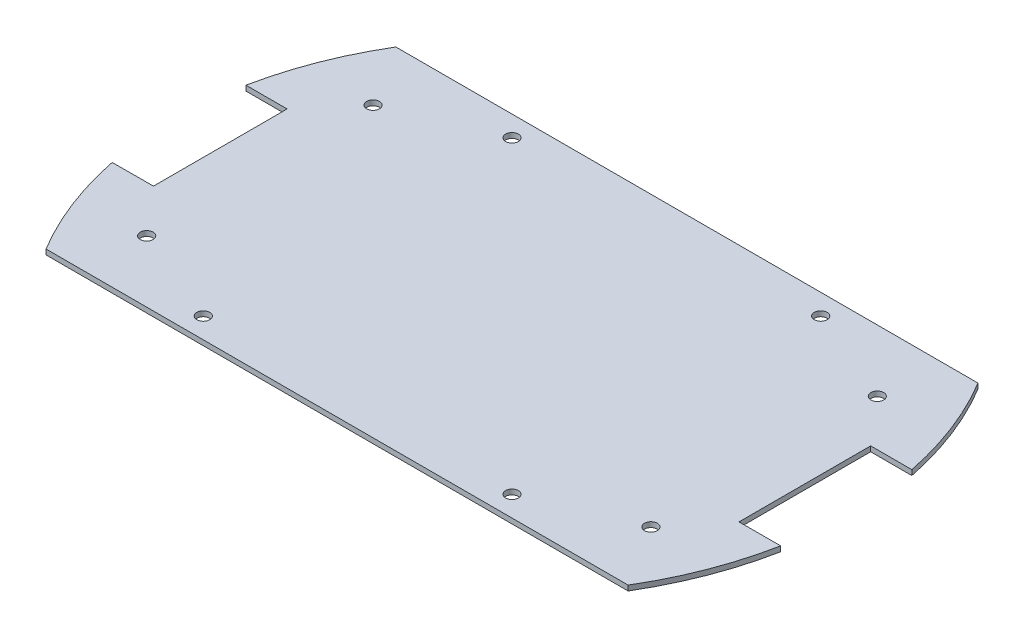
ISO-10303-21;
HEADER;
FILE_DESCRIPTION(('STEP AP214'),'2;1');
FILE_NAME('part.step','',(''),(''),'','','');
FILE_SCHEMA(('AUTOMOTIVE_DESIGN { 1 0 10303 214 1 1 1 1 }'));
ENDSEC;
DATA;
#1=APPLICATION_CONTEXT('core data for automotive mechanical design processes');
#2=APPLICATION_PROTOCOL_DEFINITION('international standard','automotive_design',2000,#1);
#3=PRODUCT_CONTEXT('',#1,'mechanical');
#4=PRODUCT('Part','Part','',(#3));
#5=PRODUCT_RELATED_PRODUCT_CATEGORY('part','',(#4));
#6=PRODUCT_DEFINITION_FORMATION('','',#4);
#7=PRODUCT_DEFINITION_CONTEXT('part definition',#1,'design');
#8=PRODUCT_DEFINITION('design','',#6,#7);
#9=PRODUCT_DEFINITION_SHAPE('','',#8);
#10=(LENGTH_UNIT() NAMED_UNIT(*) SI_UNIT(.MILLI.,.METRE.));
#11=(NAMED_UNIT(*) PLANE_ANGLE_UNIT() SI_UNIT($,.RADIAN.));
#12=(NAMED_UNIT(*) SI_UNIT($,.STERADIAN.) SOLID_ANGLE_UNIT());
#13=UNCERTAINTY_MEASURE_WITH_UNIT(LENGTH_MEASURE(1.E-05),#10,'distance_accuracy_value','');
#14=(GEOMETRIC_REPRESENTATION_CONTEXT(3) GLOBAL_UNCERTAINTY_ASSIGNED_CONTEXT((#13)) GLOBAL_UNIT_ASSIGNED_CONTEXT((#10,
#11,#12)) REPRESENTATION_CONTEXT('',''));
#15=CARTESIAN_POINT('',(0.,0.,0.));
#16=DIRECTION('',(0.,0.,1.));
#17=DIRECTION('',(1.,0.,0.));
#18=AXIS2_PLACEMENT_3D('',#15,#16,#17);
#19=CARTESIAN_POINT('',(-56.7070320753471,1.,0.));
#20=DIRECTION('',(1.,0.,0.));
#21=DIRECTION('',(0.,0.,-1.));
#22=AXIS2_PLACEMENT_3D('',#19,#20,#21);
#23=PLANE('',#22);
#24=DIRECTION('',(0.,0.,1.));
#25=VECTOR('',#24,1.);
#26=CARTESIAN_POINT('',(-56.7070320753471,0.,0.));
#27=LINE('',#26,#25);
#28=CARTESIAN_POINT('',(-56.7070320753471,0.,-13.));
#29=VERTEX_POINT('',#28);
#30=CARTESIAN_POINT('',(-56.7070320753471,0.,12.973279994282));
#31=VERTEX_POINT('',#30);
#32=EDGE_CURVE('E155',#29,#31,#27,.T.);
#33=ORIENTED_EDGE('',*,*,#32,.T.);
#34=DIRECTION('',(0.,-1.,0.));
#35=VECTOR('',#34,1.);
#36=CARTESIAN_POINT('',(-56.7070320753471,1.,12.973279994282));
#37=LINE('',#36,#35);
#38=CARTESIAN_POINT('',(-56.7070320753471,1.,12.973279994282));
#39=VERTEX_POINT('',#38);
#40=EDGE_CURVE('E11',#39,#31,#37,.T.);
#41=ORIENTED_EDGE('',*,*,#40,.F.);
#42=DIRECTION('',(0.,0.,1.));
#43=VECTOR('',#42,1.);
#44=CARTESIAN_POINT('',(-56.7070320753471,1.,0.));
#45=LINE('',#44,#43);
#46=CARTESIAN_POINT('',(-56.7070320753471,1.,-13.));
#47=VERTEX_POINT('',#46);
#48=EDGE_CURVE('E104',#47,#39,#45,.T.);
#49=ORIENTED_EDGE('',*,*,#48,.F.);
#50=DIRECTION('',(0.,-1.,0.));
#51=VECTOR('',#50,1.);
#52=CARTESIAN_POINT('',(-56.7070320753471,1.,-13.));
#53=LINE('',#52,#51);
#54=EDGE_CURVE('E180',#47,#29,#53,.T.);
#55=ORIENTED_EDGE('',*,*,#54,.T.);
#56=EDGE_LOOP('',(#33,#41,#49,#55));
#57=FACE_BOUND('',#56,.T.);
#58=ADVANCED_FACE('F35',(#57),#23,.F.);
#59=CARTESIAN_POINT('',(0.0426976868972404,1.,12.7837358563144));
#60=DIRECTION('',(-0.00333998208503997,0.,-0.99999442224428));
#61=DIRECTION('',(-0.99999442224428,0.,0.00333998208503997));
#62=AXIS2_PLACEMENT_3D('',#59,#60,#61);
#63=PLANE('',#62);
#64=DIRECTION('',(0.99999442224428,0.,-0.00333998208503997));
#65=VECTOR('',#64,1.);
#66=CARTESIAN_POINT('',(0.0426976868972404,0.,12.7837358563144));
#67=LINE('',#66,#65);
#68=CARTESIAN_POINT('',(-64.7070320753471,0.,13.));
#69=VERTEX_POINT('',#68);
#70=EDGE_CURVE('E158',#69,#31,#67,.T.);
#71=ORIENTED_EDGE('',*,*,#70,.F.);
#72=DIRECTION('',(0.,-1.,0.));
#73=VECTOR('',#72,1.);
#74=CARTESIAN_POINT('',(-64.7070320753471,1.,13.));
#75=LINE('',#74,#73);
#76=CARTESIAN_POINT('',(-64.7070320753471,1.,13.));
#77=VERTEX_POINT('',#76);
#78=EDGE_CURVE('E44',#77,#69,#75,.T.);
#79=ORIENTED_EDGE('',*,*,#78,.F.);
#80=DIRECTION('',(0.99999442224428,0.,-0.00333998208503997));
#81=VECTOR('',#80,1.);
#82=CARTESIAN_POINT('',(0.0426976868972404,1.,12.7837358563144));
#83=LINE('',#82,#81);
#84=EDGE_CURVE('E248',#77,#39,#83,.T.);
#85=ORIENTED_EDGE('',*,*,#84,.T.);
#86=ORIENTED_EDGE('',*,*,#40,.T.);
#87=EDGE_LOOP('',(#71,#79,#85,#86));
#88=FACE_BOUND('',#87,.T.);
#89=ADVANCED_FACE('F290',(#88),#63,.T.);
#90=CARTESIAN_POINT('',(0.,1.,0.));
#91=DIRECTION('',(0.,-1.,0.));
#92=DIRECTION('',(0.,0.,-1.));
#93=AXIS2_PLACEMENT_3D('',#90,#91,#92);
#94=CYLINDRICAL_SURFACE('',#93,66.);
#95=CARTESIAN_POINT('',(0.,0.,0.));
#96=DIRECTION('',(0.,1.,0.));
#97=DIRECTION('',(0.,0.,1.));
#98=AXIS2_PLACEMENT_3D('',#95,#96,#97);
#99=CIRCLE('',#98,66.);
#100=CARTESIAN_POINT('',(-56.5685424949238,0.,34.));
#101=VERTEX_POINT('',#100);
#102=EDGE_CURVE('E162',#69,#101,#99,.T.);
#103=ORIENTED_EDGE('',*,*,#102,.T.);
#104=DIRECTION('',(0.,-1.,0.));
#105=VECTOR('',#104,1.);
#106=CARTESIAN_POINT('',(-56.5685424949238,1.,34.));
#107=LINE('',#106,#105);
#108=CARTESIAN_POINT('',(-56.5685424949238,1.,34.));
#109=VERTEX_POINT('',#108);
#110=EDGE_CURVE('E196',#109,#101,#107,.T.);
#111=ORIENTED_EDGE('',*,*,#110,.F.);
#112=CARTESIAN_POINT('',(0.,1.,0.));
#113=DIRECTION('',(0.,1.,0.));
#114=DIRECTION('',(0.,0.,1.));
#115=AXIS2_PLACEMENT_3D('',#112,#113,#114);
#116=CIRCLE('',#115,66.);
#117=EDGE_CURVE('E251',#77,#109,#116,.T.);
#118=ORIENTED_EDGE('',*,*,#117,.F.);
#119=ORIENTED_EDGE('',*,*,#78,.T.);
#120=EDGE_LOOP('',(#103,#111,#118,#119));
#121=FACE_BOUND('',#120,.T.);
#122=ADVANCED_FACE('F294',(#121),#94,.T.);
#123=CARTESIAN_POINT('',(0.,1.,34.));
#124=DIRECTION('',(0.,0.,-1.));
#125=DIRECTION('',(-1.,0.,0.));
#126=AXIS2_PLACEMENT_3D('',#123,#124,#125);
#127=PLANE('',#126);
#128=DIRECTION('',(1.,0.,0.));
#129=VECTOR('',#128,1.);
#130=CARTESIAN_POINT('',(0.,0.,34.));
#131=LINE('',#130,#129);
#132=CARTESIAN_POINT('',(56.5685424949238,0.,34.));
#133=VERTEX_POINT('',#132);
#134=EDGE_CURVE('E165',#101,#133,#131,.T.);
#135=ORIENTED_EDGE('',*,*,#134,.T.);
#136=DIRECTION('',(0.,-1.,0.));
#137=VECTOR('',#136,1.);
#138=CARTESIAN_POINT('',(56.5685424949238,1.,34.));
#139=LINE('',#138,#137);
#140=CARTESIAN_POINT('',(56.5685424949238,1.,34.));
#141=VERTEX_POINT('',#140);
#142=EDGE_CURVE('E193',#141,#133,#139,.T.);
#143=ORIENTED_EDGE('',*,*,#142,.F.);
#144=DIRECTION('',(1.,0.,0.));
#145=VECTOR('',#144,1.);
#146=CARTESIAN_POINT('',(0.,1.,34.));
#147=LINE('',#146,#145);
#148=EDGE_CURVE('E254',#109,#141,#147,.T.);
#149=ORIENTED_EDGE('',*,*,#148,.F.);
#150=ORIENTED_EDGE('',*,*,#110,.T.);
#151=EDGE_LOOP('',(#135,#143,#149,#150));
#152=FACE_BOUND('',#151,.T.);
#153=ADVANCED_FACE('F301',(#152),#127,.F.);
#154=CARTESIAN_POINT('',(0.,1.,0.));
#155=DIRECTION('',(0.,-1.,0.));
#156=DIRECTION('',(0.,0.,-1.));
#157=AXIS2_PLACEMENT_3D('',#154,#155,#156);
#158=CYLINDRICAL_SURFACE('',#157,66.);
#159=CARTESIAN_POINT('',(0.,0.,0.));
#160=DIRECTION('',(0.,1.,0.));
#161=DIRECTION('',(0.,0.,1.));
#162=AXIS2_PLACEMENT_3D('',#159,#160,#161);
#163=CIRCLE('',#162,66.);
#164=CARTESIAN_POINT('',(64.7924274491416,0.,12.5674717126287));
#165=VERTEX_POINT('',#164);
#166=EDGE_CURVE('E167',#133,#165,#163,.T.);
#167=ORIENTED_EDGE('',*,*,#166,.T.);
#168=DIRECTION('',(0.,-1.,0.));
#169=VECTOR('',#168,1.);
#170=CARTESIAN_POINT('',(64.7924274491416,1.,12.5674717126287));
#171=LINE('',#170,#169);
#172=CARTESIAN_POINT('',(64.7924274491416,1.,12.5674717126287));
#173=VERTEX_POINT('',#172);
#174=EDGE_CURVE('E191',#173,#165,#171,.T.);
#175=ORIENTED_EDGE('',*,*,#174,.F.);
#176=CARTESIAN_POINT('',(0.,1.,0.));
#177=DIRECTION('',(0.,1.,0.));
#178=DIRECTION('',(0.,0.,1.));
#179=AXIS2_PLACEMENT_3D('',#176,#177,#178);
#180=CIRCLE('',#179,66.);
#181=EDGE_CURVE('E256',#141,#173,#180,.T.);
#182=ORIENTED_EDGE('',*,*,#181,.F.);
#183=ORIENTED_EDGE('',*,*,#142,.T.);
#184=EDGE_LOOP('',(#167,#175,#182,#183));
#185=FACE_BOUND('',#184,.T.);
#186=ADVANCED_FACE('F306',(#185),#158,.T.);
#187=CARTESIAN_POINT('',(56.7070320753471,0.,12.5944769389562));
#188=VERTEX_POINT('',#187);
#189=EDGE_CURVE('E163',#188,#165,#67,.T.);
#190=ORIENTED_EDGE('',*,*,#189,.F.);
#191=DIRECTION('',(0.,-1.,0.));
#192=VECTOR('',#191,1.);
#193=CARTESIAN_POINT('',(56.7070320753471,1.,12.5944769389562));
#194=LINE('',#193,#192);
#195=CARTESIAN_POINT('',(56.7070320753471,1.,12.5944769389562));
#196=VERTEX_POINT('',#195);
#197=EDGE_CURVE('E189',#196,#188,#194,.T.);
#198=ORIENTED_EDGE('',*,*,#197,.F.);
#199=EDGE_CURVE('E252',#196,#173,#83,.T.);
#200=ORIENTED_EDGE('',*,*,#199,.T.);
#201=ORIENTED_EDGE('',*,*,#174,.T.);
#202=EDGE_LOOP('',(#190,#198,#200,#201));
#203=FACE_BOUND('',#202,.T.);
#204=ADVANCED_FACE('F297',(#203),#63,.T.);
#205=CARTESIAN_POINT('',(56.7070320753471,1.,0.));
#206=DIRECTION('',(1.,0.,0.));
#207=DIRECTION('',(0.,0.,-1.));
#208=AXIS2_PLACEMENT_3D('',#205,#206,#207);
#209=PLANE('',#208);
#210=DIRECTION('',(0.,0.,1.));
#211=VECTOR('',#210,1.);
#212=CARTESIAN_POINT('',(56.7070320753471,0.,0.));
#213=LINE('',#212,#211);
#214=CARTESIAN_POINT('',(56.7070320753471,0.,-13.));
#215=VERTEX_POINT('',#214);
#216=EDGE_CURVE('E170',#215,#188,#213,.T.);
#217=ORIENTED_EDGE('',*,*,#216,.F.);
#218=DIRECTION('',(0.,-1.,0.));
#219=VECTOR('',#218,1.);
#220=CARTESIAN_POINT('',(56.7070320753471,1.,-13.));
#221=LINE('',#220,#219);
#222=CARTESIAN_POINT('',(56.7070320753471,1.,-13.));
#223=VERTEX_POINT('',#222);
#224=EDGE_CURVE('E187',#223,#215,#221,.T.);
#225=ORIENTED_EDGE('',*,*,#224,.F.);
#226=DIRECTION('',(0.,0.,1.));
#227=VECTOR('',#226,1.);
#228=CARTESIAN_POINT('',(56.7070320753471,1.,0.));
#229=LINE('',#228,#227);
#230=EDGE_CURVE('E258',#223,#196,#229,.T.);
#231=ORIENTED_EDGE('',*,*,#230,.T.);
#232=ORIENTED_EDGE('',*,*,#197,.T.);
#233=EDGE_LOOP('',(#217,#225,#231,#232));
#234=FACE_BOUND('',#233,.T.);
#235=ADVANCED_FACE('F288',(#234),#209,.T.);
#236=CARTESIAN_POINT('',(0.,1.,-13.));
#237=DIRECTION('',(0.,0.,-1.));
#238=DIRECTION('',(-1.,0.,0.));
#239=AXIS2_PLACEMENT_3D('',#236,#237,#238);
#240=PLANE('',#239);
#241=DIRECTION('',(1.,0.,0.));
#242=VECTOR('',#241,1.);
#243=CARTESIAN_POINT('',(0.,0.,-13.));
#244=LINE('',#243,#242);
#245=CARTESIAN_POINT('',(64.7070320753471,0.,-13.));
#246=VERTEX_POINT('',#245);
#247=EDGE_CURVE('E173',#215,#246,#244,.T.);
#248=ORIENTED_EDGE('',*,*,#247,.T.);
#249=DIRECTION('',(0.,-1.,0.));
#250=VECTOR('',#249,1.);
#251=CARTESIAN_POINT('',(64.7070320753471,1.,-13.));
#252=LINE('',#251,#250);
#253=CARTESIAN_POINT('',(64.7070320753471,1.,-13.));
#254=VERTEX_POINT('',#253);
#255=EDGE_CURVE('E184',#254,#246,#252,.T.);
#256=ORIENTED_EDGE('',*,*,#255,.F.);
#257=DIRECTION('',(1.,0.,0.));
#258=VECTOR('',#257,1.);
#259=CARTESIAN_POINT('',(0.,1.,-13.));
#260=LINE('',#259,#258);
#261=EDGE_CURVE('E151',#223,#254,#260,.T.);
#262=ORIENTED_EDGE('',*,*,#261,.F.);
#263=ORIENTED_EDGE('',*,*,#224,.T.);
#264=EDGE_LOOP('',(#248,#256,#262,#263));
#265=FACE_BOUND('',#264,.T.);
#266=ADVANCED_FACE('F265',(#265),#240,.F.);
#267=CARTESIAN_POINT('',(0.,1.,0.));
#268=DIRECTION('',(0.,-1.,0.));
#269=DIRECTION('',(0.,0.,-1.));
#270=AXIS2_PLACEMENT_3D('',#267,#268,#269);
#271=CYLINDRICAL_SURFACE('',#270,66.);
#272=CARTESIAN_POINT('',(0.,0.,0.));
#273=DIRECTION('',(0.,1.,0.));
#274=DIRECTION('',(0.,0.,1.));
#275=AXIS2_PLACEMENT_3D('',#272,#273,#274);
#276=CIRCLE('',#275,66.);
#277=CARTESIAN_POINT('',(56.5685424949238,0.,-34.));
#278=VERTEX_POINT('',#277);
#279=EDGE_CURVE('E175',#246,#278,#276,.T.);
#280=ORIENTED_EDGE('',*,*,#279,.T.);
#281=DIRECTION('',(0.,-1.,0.));
#282=VECTOR('',#281,1.);
#283=CARTESIAN_POINT('',(56.5685424949238,1.,-34.));
#284=LINE('',#283,#282);
#285=CARTESIAN_POINT('',(56.5685424949238,1.,-34.));
#286=VERTEX_POINT('',#285);
#287=EDGE_CURVE('E140',#286,#278,#284,.T.);
#288=ORIENTED_EDGE('',*,*,#287,.F.);
#289=CARTESIAN_POINT('',(0.,1.,0.));
#290=DIRECTION('',(0.,1.,0.));
#291=DIRECTION('',(0.,0.,1.));
#292=AXIS2_PLACEMENT_3D('',#289,#290,#291);
#293=CIRCLE('',#292,66.);
#294=EDGE_CURVE('E148',#254,#286,#293,.T.);
#295=ORIENTED_EDGE('',*,*,#294,.F.);
#296=ORIENTED_EDGE('',*,*,#255,.T.);
#297=EDGE_LOOP('',(#280,#288,#295,#296));
#298=FACE_BOUND('',#297,.T.);
#299=ADVANCED_FACE('F269',(#298),#271,.T.);
#300=CARTESIAN_POINT('',(0.,1.,-34.));
#301=DIRECTION('',(0.,0.,-1.));
#302=DIRECTION('',(-1.,0.,0.));
#303=AXIS2_PLACEMENT_3D('',#300,#301,#302);
#304=PLANE('',#303);
#305=DIRECTION('',(1.,0.,0.));
#306=VECTOR('',#305,1.);
#307=CARTESIAN_POINT('',(0.,0.,-34.));
#308=LINE('',#307,#306);
#309=CARTESIAN_POINT('',(-56.5685424949238,0.,-34.));
#310=VERTEX_POINT('',#309);
#311=EDGE_CURVE('E139',#310,#278,#308,.T.);
#312=ORIENTED_EDGE('',*,*,#311,.F.);
#313=DIRECTION('',(0.,-1.,0.));
#314=VECTOR('',#313,1.);
#315=CARTESIAN_POINT('',(-56.5685424949238,1.,-34.));
#316=LINE('',#315,#314);
#317=CARTESIAN_POINT('',(-56.5685424949238,1.,-34.));
#318=VERTEX_POINT('',#317);
#319=EDGE_CURVE('E133',#318,#310,#316,.T.);
#320=ORIENTED_EDGE('',*,*,#319,.F.);
#321=DIRECTION('',(1.,0.,0.));
#322=VECTOR('',#321,1.);
#323=CARTESIAN_POINT('',(0.,1.,-34.));
#324=LINE('',#323,#322);
#325=EDGE_CURVE('E137',#318,#286,#324,.T.);
#326=ORIENTED_EDGE('',*,*,#325,.T.);
#327=ORIENTED_EDGE('',*,*,#287,.T.);
#328=EDGE_LOOP('',(#312,#320,#326,#327));
#329=FACE_BOUND('',#328,.T.);
#330=ADVANCED_FACE('F135',(#329),#304,.T.);
#331=CARTESIAN_POINT('',(0.,1.,0.));
#332=DIRECTION('',(0.,-1.,0.));
#333=DIRECTION('',(0.,0.,-1.));
#334=AXIS2_PLACEMENT_3D('',#331,#332,#333);
#335=CYLINDRICAL_SURFACE('',#334,66.);
#336=CARTESIAN_POINT('',(0.,0.,0.));
#337=DIRECTION('',(0.,1.,0.));
#338=DIRECTION('',(0.,0.,1.));
#339=AXIS2_PLACEMENT_3D('',#336,#337,#338);
#340=CIRCLE('',#339,66.);
#341=CARTESIAN_POINT('',(-64.7070320753471,0.,-13.));
#342=VERTEX_POINT('',#341);
#343=EDGE_CURVE('E92',#310,#342,#340,.T.);
#344=ORIENTED_EDGE('',*,*,#343,.T.);
#345=DIRECTION('',(0.,-1.,0.));
#346=VECTOR('',#345,1.);
#347=CARTESIAN_POINT('',(-64.7070320753471,1.,-13.));
#348=LINE('',#347,#346);
#349=CARTESIAN_POINT('',(-64.7070320753471,1.,-13.));
#350=VERTEX_POINT('',#349);
#351=EDGE_CURVE('E141',#350,#342,#348,.T.);
#352=ORIENTED_EDGE('',*,*,#351,.F.);
#353=CARTESIAN_POINT('',(0.,1.,0.));
#354=DIRECTION('',(0.,1.,0.));
#355=DIRECTION('',(0.,0.,1.));
#356=AXIS2_PLACEMENT_3D('',#353,#354,#355);
#357=CIRCLE('',#356,66.);
#358=EDGE_CURVE('E143',#318,#350,#357,.T.);
#359=ORIENTED_EDGE('',*,*,#358,.F.);
#360=ORIENTED_EDGE('',*,*,#319,.T.);
#361=EDGE_LOOP('',(#344,#352,#359,#360));
#362=FACE_BOUND('',#361,.T.);
#363=ADVANCED_FACE('F144',(#362),#335,.T.);
#364=EDGE_CURVE('E98',#342,#29,#244,.T.);
#365=ORIENTED_EDGE('',*,*,#364,.T.);
#366=ORIENTED_EDGE('',*,*,#54,.F.);
#367=EDGE_CURVE('E53',#350,#47,#260,.T.);
#368=ORIENTED_EDGE('',*,*,#367,.F.);
#369=ORIENTED_EDGE('',*,*,#351,.T.);
#370=EDGE_LOOP('',(#365,#366,#368,#369));
#371=FACE_BOUND('',#370,.T.);
#372=ADVANCED_FACE('F276',(#371),#240,.F.);
#373=CARTESIAN_POINT('',(0.,1.,0.));
#374=DIRECTION('',(0.,1.,0.));
#375=DIRECTION('',(0.,0.,1.));
#376=AXIS2_PLACEMENT_3D('',#373,#374,#375);
#377=PLANE('',#376);
#378=CARTESIAN_POINT('',(49.,1.,22.));
#379=DIRECTION('',(0.,1.,0.));
#380=DIRECTION('',(0.,0.,1.));
#381=AXIS2_PLACEMENT_3D('',#378,#379,#380);
#382=CIRCLE('',#381,1.25);
#383=CARTESIAN_POINT('',(49.,1.,23.25));
#384=VERTEX_POINT('',#383);
#385=EDGE_CURVE('E225',#384,#384,#382,.T.);
#386=ORIENTED_EDGE('',*,*,#385,.F.);
#387=EDGE_LOOP('',(#386));
#388=FACE_BOUND('',#387,.T.);
#389=CARTESIAN_POINT('',(49.,1.,-22.));
#390=DIRECTION('',(0.,1.,0.));
#391=DIRECTION('',(0.,0.,1.));
#392=AXIS2_PLACEMENT_3D('',#389,#390,#391);
#393=CIRCLE('',#392,1.25);
#394=CARTESIAN_POINT('',(49.,1.,-20.75));
#395=VERTEX_POINT('',#394);
#396=EDGE_CURVE('E215',#395,#395,#393,.T.);
#397=ORIENTED_EDGE('',*,*,#396,.F.);
#398=EDGE_LOOP('',(#397));
#399=FACE_BOUND('',#398,.T.);
#400=CARTESIAN_POINT('',(-49.,1.,22.));
#401=DIRECTION('',(0.,1.,0.));
#402=DIRECTION('',(0.,0.,1.));
#403=AXIS2_PLACEMENT_3D('',#400,#401,#402);
#404=CIRCLE('',#403,1.25);
#405=CARTESIAN_POINT('',(-49.,1.,23.25));
#406=VERTEX_POINT('',#405);
#407=EDGE_CURVE('E212',#406,#406,#404,.T.);
#408=ORIENTED_EDGE('',*,*,#407,.F.);
#409=EDGE_LOOP('',(#408));
#410=FACE_BOUND('',#409,.T.);
#411=CARTESIAN_POINT('',(-49.,1.,-22.));
#412=DIRECTION('',(0.,1.,0.));
#413=DIRECTION('',(0.,0.,1.));
#414=AXIS2_PLACEMENT_3D('',#411,#412,#413);
#415=CIRCLE('',#414,1.25);
#416=CARTESIAN_POINT('',(-49.,1.,-20.75));
#417=VERTEX_POINT('',#416);
#418=EDGE_CURVE('E209',#417,#417,#415,.T.);
#419=ORIENTED_EDGE('',*,*,#418,.F.);
#420=EDGE_LOOP('',(#419));
#421=FACE_BOUND('',#420,.T.);
#422=CARTESIAN_POINT('',(-30.,1.,-30.));
#423=DIRECTION('',(0.,1.,0.));
#424=DIRECTION('',(0.,0.,1.));
#425=AXIS2_PLACEMENT_3D('',#422,#423,#424);
#426=CIRCLE('',#425,1.25);
#427=CARTESIAN_POINT('',(-30.,1.,-28.75));
#428=VERTEX_POINT('',#427);
#429=EDGE_CURVE('E208',#428,#428,#426,.T.);
#430=ORIENTED_EDGE('',*,*,#429,.F.);
#431=EDGE_LOOP('',(#430));
#432=FACE_BOUND('',#431,.T.);
#433=CARTESIAN_POINT('',(-29.9999999999983,1.,30.));
#434=DIRECTION('',(0.,1.,0.));
#435=DIRECTION('',(0.,0.,1.));
#436=AXIS2_PLACEMENT_3D('',#433,#434,#435);
#437=CIRCLE('',#436,1.25);
#438=CARTESIAN_POINT('',(-29.9999999999983,1.,31.25));
#439=VERTEX_POINT('',#438);
#440=EDGE_CURVE('E235',#439,#439,#437,.T.);
#441=ORIENTED_EDGE('',*,*,#440,.F.);
#442=EDGE_LOOP('',(#441));
#443=FACE_BOUND('',#442,.T.);
#444=CARTESIAN_POINT('',(30.,1.,-30.0000000000017));
#445=DIRECTION('',(0.,1.,0.));
#446=DIRECTION('',(0.,0.,1.));
#447=AXIS2_PLACEMENT_3D('',#444,#445,#446);
#448=CIRCLE('',#447,1.25);
#449=CARTESIAN_POINT('',(30.,1.,-28.7500000000017));
#450=VERTEX_POINT('',#449);
#451=EDGE_CURVE('E204',#450,#450,#448,.T.);
#452=ORIENTED_EDGE('',*,*,#451,.F.);
#453=EDGE_LOOP('',(#452));
#454=FACE_BOUND('',#453,.T.);
#455=CARTESIAN_POINT('',(30.0000000000017,1.,29.9999999999983));
#456=DIRECTION('',(0.,1.,0.));
#457=DIRECTION('',(0.,0.,1.));
#458=AXIS2_PLACEMENT_3D('',#455,#456,#457);
#459=CIRCLE('',#458,1.25);
#460=CARTESIAN_POINT('',(30.0000000000017,1.,31.2499999999983));
#461=VERTEX_POINT('',#460);
#462=EDGE_CURVE('E203',#461,#461,#459,.T.);
#463=ORIENTED_EDGE('',*,*,#462,.F.);
#464=EDGE_LOOP('',(#463));
#465=FACE_BOUND('',#464,.T.);
#466=ORIENTED_EDGE('',*,*,#48,.T.);
#467=ORIENTED_EDGE('',*,*,#84,.F.);
#468=ORIENTED_EDGE('',*,*,#117,.T.);
#469=ORIENTED_EDGE('',*,*,#148,.T.);
#470=ORIENTED_EDGE('',*,*,#181,.T.);
#471=ORIENTED_EDGE('',*,*,#199,.F.);
#472=ORIENTED_EDGE('',*,*,#230,.F.);
#473=ORIENTED_EDGE('',*,*,#261,.T.);
#474=ORIENTED_EDGE('',*,*,#294,.T.);
#475=ORIENTED_EDGE('',*,*,#325,.F.);
#476=ORIENTED_EDGE('',*,*,#358,.T.);
#477=ORIENTED_EDGE('',*,*,#367,.T.);
#478=EDGE_LOOP('',(#466,#467,#468,#469,#470,#471,#472,#473,#474,#475,#476,#477));
#479=FACE_BOUND('',#478,.T.);
#480=ADVANCED_FACE('F146',(#388,#399,#410,#421,#432,#443,#454,#465,#479),#377,.T.);
#481=CARTESIAN_POINT('',(0.,0.,0.));
#482=DIRECTION('',(0.,1.,0.));
#483=DIRECTION('',(0.,0.,1.));
#484=AXIS2_PLACEMENT_3D('',#481,#482,#483);
#485=PLANE('',#484);
#486=CARTESIAN_POINT('',(49.,0.,22.));
#487=DIRECTION('',(0.,1.,0.));
#488=DIRECTION('',(0.,0.,1.));
#489=AXIS2_PLACEMENT_3D('',#486,#487,#488);
#490=CIRCLE('',#489,1.25);
#491=CARTESIAN_POINT('',(49.,0.,23.25));
#492=VERTEX_POINT('',#491);
#493=EDGE_CURVE('E38',#492,#492,#490,.T.);
#494=ORIENTED_EDGE('',*,*,#493,.T.);
#495=EDGE_LOOP('',(#494));
#496=FACE_BOUND('',#495,.T.);
#497=CARTESIAN_POINT('',(49.,0.,-22.));
#498=DIRECTION('',(0.,1.,0.));
#499=DIRECTION('',(0.,0.,1.));
#500=AXIS2_PLACEMENT_3D('',#497,#498,#499);
#501=CIRCLE('',#500,1.25);
#502=CARTESIAN_POINT('',(49.,0.,-20.75));
#503=VERTEX_POINT('',#502);
#504=EDGE_CURVE('E213',#503,#503,#501,.T.);
#505=ORIENTED_EDGE('',*,*,#504,.T.);
#506=EDGE_LOOP('',(#505));
#507=FACE_BOUND('',#506,.T.);
#508=CARTESIAN_POINT('',(-49.,0.,22.));
#509=DIRECTION('',(0.,1.,0.));
#510=DIRECTION('',(0.,0.,1.));
#511=AXIS2_PLACEMENT_3D('',#508,#509,#510);
#512=CIRCLE('',#511,1.25);
#513=CARTESIAN_POINT('',(-49.,0.,23.25));
#514=VERTEX_POINT('',#513);
#515=EDGE_CURVE('E210',#514,#514,#512,.T.);
#516=ORIENTED_EDGE('',*,*,#515,.T.);
#517=EDGE_LOOP('',(#516));
#518=FACE_BOUND('',#517,.T.);
#519=CARTESIAN_POINT('',(-49.,0.,-22.));
#520=DIRECTION('',(0.,1.,0.));
#521=DIRECTION('',(0.,0.,1.));
#522=AXIS2_PLACEMENT_3D('',#519,#520,#521);
#523=CIRCLE('',#522,1.25);
#524=CARTESIAN_POINT('',(-49.,0.,-20.75));
#525=VERTEX_POINT('',#524);
#526=EDGE_CURVE('E205',#525,#525,#523,.T.);
#527=ORIENTED_EDGE('',*,*,#526,.T.);
#528=EDGE_LOOP('',(#527));
#529=FACE_BOUND('',#528,.T.);
#530=CARTESIAN_POINT('',(-30.,0.,-30.));
#531=DIRECTION('',(0.,1.,0.));
#532=DIRECTION('',(0.,0.,1.));
#533=AXIS2_PLACEMENT_3D('',#530,#531,#532);
#534=CIRCLE('',#533,1.25);
#535=CARTESIAN_POINT('',(-30.,0.,-28.75));
#536=VERTEX_POINT('',#535);
#537=EDGE_CURVE('E232',#536,#536,#534,.T.);
#538=ORIENTED_EDGE('',*,*,#537,.T.);
#539=EDGE_LOOP('',(#538));
#540=FACE_BOUND('',#539,.T.);
#541=CARTESIAN_POINT('',(-29.9999999999983,0.,30.));
#542=DIRECTION('',(0.,1.,0.));
#543=DIRECTION('',(0.,0.,1.));
#544=AXIS2_PLACEMENT_3D('',#541,#542,#543);
#545=CIRCLE('',#544,1.25);
#546=CARTESIAN_POINT('',(-29.9999999999983,0.,31.25));
#547=VERTEX_POINT('',#546);
#548=EDGE_CURVE('E238',#547,#547,#545,.T.);
#549=ORIENTED_EDGE('',*,*,#548,.T.);
#550=EDGE_LOOP('',(#549));
#551=FACE_BOUND('',#550,.T.);
#552=CARTESIAN_POINT('',(30.,0.,-30.0000000000017));
#553=DIRECTION('',(0.,1.,0.));
#554=DIRECTION('',(0.,0.,1.));
#555=AXIS2_PLACEMENT_3D('',#552,#553,#554);
#556=CIRCLE('',#555,1.25);
#557=CARTESIAN_POINT('',(30.,0.,-28.7500000000017));
#558=VERTEX_POINT('',#557);
#559=EDGE_CURVE('E200',#558,#558,#556,.T.);
#560=ORIENTED_EDGE('',*,*,#559,.T.);
#561=EDGE_LOOP('',(#560));
#562=FACE_BOUND('',#561,.T.);
#563=CARTESIAN_POINT('',(30.0000000000017,0.,29.9999999999983));
#564=DIRECTION('',(0.,1.,0.));
#565=DIRECTION('',(0.,0.,1.));
#566=AXIS2_PLACEMENT_3D('',#563,#564,#565);
#567=CIRCLE('',#566,1.25);
#568=CARTESIAN_POINT('',(30.0000000000017,0.,31.2499999999983));
#569=VERTEX_POINT('',#568);
#570=EDGE_CURVE('E159',#569,#569,#567,.T.);
#571=ORIENTED_EDGE('',*,*,#570,.T.);
#572=EDGE_LOOP('',(#571));
#573=FACE_BOUND('',#572,.T.);
#574=ORIENTED_EDGE('',*,*,#32,.F.);
#575=ORIENTED_EDGE('',*,*,#364,.F.);
#576=ORIENTED_EDGE('',*,*,#343,.F.);
#577=ORIENTED_EDGE('',*,*,#311,.T.);
#578=ORIENTED_EDGE('',*,*,#279,.F.);
#579=ORIENTED_EDGE('',*,*,#247,.F.);
#580=ORIENTED_EDGE('',*,*,#216,.T.);
#581=ORIENTED_EDGE('',*,*,#189,.T.);
#582=ORIENTED_EDGE('',*,*,#166,.F.);
#583=ORIENTED_EDGE('',*,*,#134,.F.);
#584=ORIENTED_EDGE('',*,*,#102,.F.);
#585=ORIENTED_EDGE('',*,*,#70,.T.);
#586=EDGE_LOOP('',(#574,#575,#576,#577,#578,#579,#580,#581,#582,#583,#584,#585));
#587=FACE_BOUND('',#586,.T.);
#588=ADVANCED_FACE('F272',(#496,#507,#518,#529,#540,#551,#562,#573,#587),#485,.F.);
#589=CARTESIAN_POINT('',(30.0000000000017,1.,29.9999999999983));
#590=DIRECTION('',(0.,1.,0.));
#591=DIRECTION('',(0.,0.,1.));
#592=AXIS2_PLACEMENT_3D('',#589,#590,#591);
#593=CYLINDRICAL_SURFACE('',#592,1.25);
#594=ORIENTED_EDGE('',*,*,#462,.T.);
#595=EDGE_LOOP('',(#594));
#596=FACE_BOUND('',#595,.T.);
#597=ORIENTED_EDGE('',*,*,#570,.F.);
#598=EDGE_LOOP('',(#597));
#599=FACE_BOUND('',#598,.T.);
#600=ADVANCED_FACE('F385',(#596,#599),#593,.F.);
#601=CARTESIAN_POINT('',(30.,1.,-30.0000000000017));
#602=DIRECTION('',(0.,1.,0.));
#603=DIRECTION('',(0.,0.,1.));
#604=AXIS2_PLACEMENT_3D('',#601,#602,#603);
#605=CYLINDRICAL_SURFACE('',#604,1.25);
#606=ORIENTED_EDGE('',*,*,#451,.T.);
#607=EDGE_LOOP('',(#606));
#608=FACE_BOUND('',#607,.T.);
#609=ORIENTED_EDGE('',*,*,#559,.F.);
#610=EDGE_LOOP('',(#609));
#611=FACE_BOUND('',#610,.T.);
#612=ADVANCED_FACE('F390',(#608,#611),#605,.F.);
#613=CARTESIAN_POINT('',(-29.9999999999983,1.,30.));
#614=DIRECTION('',(0.,1.,0.));
#615=DIRECTION('',(0.,0.,1.));
#616=AXIS2_PLACEMENT_3D('',#613,#614,#615);
#617=CYLINDRICAL_SURFACE('',#616,1.25);
#618=ORIENTED_EDGE('',*,*,#440,.T.);
#619=EDGE_LOOP('',(#618));
#620=FACE_BOUND('',#619,.T.);
#621=ORIENTED_EDGE('',*,*,#548,.F.);
#622=EDGE_LOOP('',(#621));
#623=FACE_BOUND('',#622,.T.);
#624=ADVANCED_FACE('F402',(#620,#623),#617,.F.);
#625=CARTESIAN_POINT('',(-30.,1.,-30.));
#626=DIRECTION('',(0.,1.,0.));
#627=DIRECTION('',(0.,0.,1.));
#628=AXIS2_PLACEMENT_3D('',#625,#626,#627);
#629=CYLINDRICAL_SURFACE('',#628,1.25);
#630=ORIENTED_EDGE('',*,*,#429,.T.);
#631=EDGE_LOOP('',(#630));
#632=FACE_BOUND('',#631,.T.);
#633=ORIENTED_EDGE('',*,*,#537,.F.);
#634=EDGE_LOOP('',(#633));
#635=FACE_BOUND('',#634,.T.);
#636=ADVANCED_FACE('F412',(#632,#635),#629,.F.);
#637=CARTESIAN_POINT('',(-49.,1.,-22.));
#638=DIRECTION('',(0.,1.,0.));
#639=DIRECTION('',(0.,0.,1.));
#640=AXIS2_PLACEMENT_3D('',#637,#638,#639);
#641=CYLINDRICAL_SURFACE('',#640,1.25);
#642=ORIENTED_EDGE('',*,*,#418,.T.);
#643=EDGE_LOOP('',(#642));
#644=FACE_BOUND('',#643,.T.);
#645=ORIENTED_EDGE('',*,*,#526,.F.);
#646=EDGE_LOOP('',(#645));
#647=FACE_BOUND('',#646,.T.);
#648=ADVANCED_FACE('F422',(#644,#647),#641,.F.);
#649=CARTESIAN_POINT('',(-49.,1.,22.));
#650=DIRECTION('',(0.,1.,0.));
#651=DIRECTION('',(0.,0.,1.));
#652=AXIS2_PLACEMENT_3D('',#649,#650,#651);
#653=CYLINDRICAL_SURFACE('',#652,1.25);
#654=ORIENTED_EDGE('',*,*,#407,.T.);
#655=EDGE_LOOP('',(#654));
#656=FACE_BOUND('',#655,.T.);
#657=ORIENTED_EDGE('',*,*,#515,.F.);
#658=EDGE_LOOP('',(#657));
#659=FACE_BOUND('',#658,.T.);
#660=ADVANCED_FACE('F432',(#656,#659),#653,.F.);
#661=CARTESIAN_POINT('',(49.,1.,-22.));
#662=DIRECTION('',(0.,1.,0.));
#663=DIRECTION('',(0.,0.,1.));
#664=AXIS2_PLACEMENT_3D('',#661,#662,#663);
#665=CYLINDRICAL_SURFACE('',#664,1.25);
#666=ORIENTED_EDGE('',*,*,#396,.T.);
#667=EDGE_LOOP('',(#666));
#668=FACE_BOUND('',#667,.T.);
#669=ORIENTED_EDGE('',*,*,#504,.F.);
#670=EDGE_LOOP('',(#669));
#671=FACE_BOUND('',#670,.T.);
#672=ADVANCED_FACE('F457',(#668,#671),#665,.F.);
#673=CARTESIAN_POINT('',(49.,1.,22.));
#674=DIRECTION('',(0.,1.,0.));
#675=DIRECTION('',(0.,0.,1.));
#676=AXIS2_PLACEMENT_3D('',#673,#674,#675);
#677=CYLINDRICAL_SURFACE('',#676,1.25);
#678=ORIENTED_EDGE('',*,*,#385,.T.);
#679=EDGE_LOOP('',(#678));
#680=FACE_BOUND('',#679,.T.);
#681=ORIENTED_EDGE('',*,*,#493,.F.);
#682=EDGE_LOOP('',(#681));
#683=FACE_BOUND('',#682,.T.);
#684=ADVANCED_FACE('F467',(#680,#683),#677,.F.);
#685=CLOSED_SHELL('',(#58,#89,#122,#153,#186,#204,#235,#266,#299,#330,#363,#372,#480,#588,#600,
#612,#624,#636,#648,#660,#672,#684));
#686=MANIFOLD_SOLID_BREP('B2',#685);
#687=ADVANCED_BREP_SHAPE_REPRESENTATION('',(#18,#686),#14);
#688=SHAPE_DEFINITION_REPRESENTATION(#9,#687);
ENDSEC;
END-ISO-10303-21;
